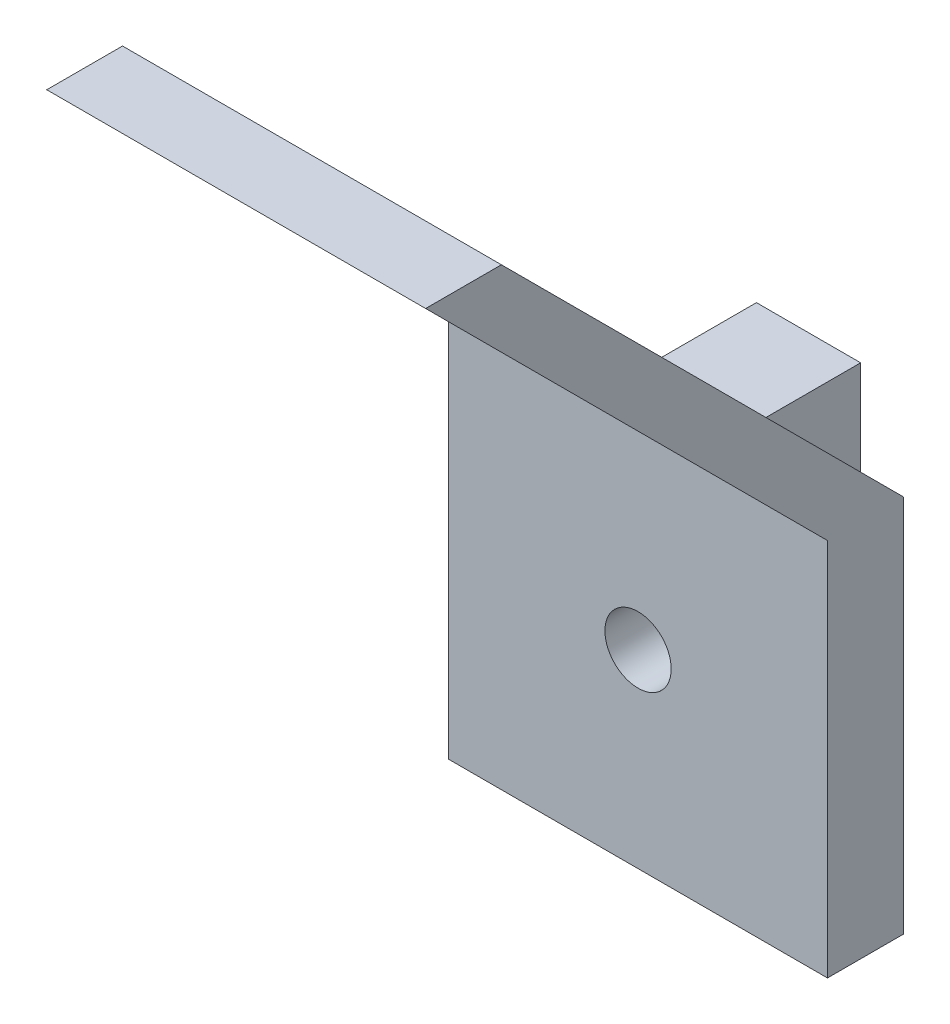
ISO-10303-21;
HEADER;
FILE_DESCRIPTION(('STEP AP214'),'2;1');
FILE_NAME('part.step','',(''),(''),'','','');
FILE_SCHEMA(('AUTOMOTIVE_DESIGN { 1 0 10303 214 1 1 1 1 }'));
ENDSEC;
DATA;
#1=APPLICATION_CONTEXT('core data for automotive mechanical design processes');
#2=APPLICATION_PROTOCOL_DEFINITION('international standard','automotive_design',2000,#1);
#3=PRODUCT_CONTEXT('',#1,'mechanical');
#4=PRODUCT('Part','Part','',(#3));
#5=PRODUCT_RELATED_PRODUCT_CATEGORY('part','',(#4));
#6=PRODUCT_DEFINITION_FORMATION('','',#4);
#7=PRODUCT_DEFINITION_CONTEXT('part definition',#1,'design');
#8=PRODUCT_DEFINITION('design','',#6,#7);
#9=PRODUCT_DEFINITION_SHAPE('','',#8);
#10=(LENGTH_UNIT() NAMED_UNIT(*) SI_UNIT(.MILLI.,.METRE.));
#11=(NAMED_UNIT(*) PLANE_ANGLE_UNIT() SI_UNIT($,.RADIAN.));
#12=(NAMED_UNIT(*) SI_UNIT($,.STERADIAN.) SOLID_ANGLE_UNIT());
#13=UNCERTAINTY_MEASURE_WITH_UNIT(LENGTH_MEASURE(1.E-05),#10,'distance_accuracy_value','');
#14=(GEOMETRIC_REPRESENTATION_CONTEXT(3) GLOBAL_UNCERTAINTY_ASSIGNED_CONTEXT((#13)) GLOBAL_UNIT_ASSIGNED_CONTEXT((#10,
#11,#12)) REPRESENTATION_CONTEXT('',''));
#15=CARTESIAN_POINT('',(0.,0.,0.));
#16=DIRECTION('',(0.,0.,1.));
#17=DIRECTION('',(1.,0.,0.));
#18=AXIS2_PLACEMENT_3D('',#15,#16,#17);
#19=CARTESIAN_POINT('',(20.,0.,0.));
#20=DIRECTION('',(0.,0.,1.));
#21=DIRECTION('',(1.,0.,0.));
#22=AXIS2_PLACEMENT_3D('',#19,#20,#21);
#23=PLANE('',#22);
#24=CARTESIAN_POINT('',(10.,9.99999999999999,0.));
#25=DIRECTION('',(0.,0.,1.));
#26=DIRECTION('',(1.,0.,0.));
#27=AXIS2_PLACEMENT_3D('',#24,#25,#26);
#28=CIRCLE('',#27,1.75);
#29=CARTESIAN_POINT('',(11.75,9.99999999999999,0.));
#30=VERTEX_POINT('',#29);
#31=EDGE_CURVE('E224',#30,#30,#28,.T.);
#32=ORIENTED_EDGE('',*,*,#31,.T.);
#33=EDGE_LOOP('',(#32));
#34=FACE_BOUND('',#33,.T.);
#35=DIRECTION('',(0.,-1.,0.));
#36=VECTOR('',#35,1.);
#37=CARTESIAN_POINT('',(12.75,0.,0.));
#38=LINE('',#37,#36);
#39=CARTESIAN_POINT('',(12.75,5.,0.));
#40=VERTEX_POINT('',#39);
#41=CARTESIAN_POINT('',(12.75,0.,0.));
#42=VERTEX_POINT('',#41);
#43=EDGE_CURVE('E54',#40,#42,#38,.T.);
#44=ORIENTED_EDGE('',*,*,#43,.F.);
#45=DIRECTION('',(1.,0.,0.));
#46=VECTOR('',#45,1.);
#47=CARTESIAN_POINT('',(7.25,5.,0.));
#48=LINE('',#47,#46);
#49=CARTESIAN_POINT('',(7.25,5.,0.));
#50=VERTEX_POINT('',#49);
#51=EDGE_CURVE('E58',#50,#40,#48,.T.);
#52=ORIENTED_EDGE('',*,*,#51,.F.);
#53=DIRECTION('',(0.,1.,0.));
#54=VECTOR('',#53,1.);
#55=CARTESIAN_POINT('',(7.25,0.,0.));
#56=LINE('',#55,#54);
#57=CARTESIAN_POINT('',(7.25,0.,0.));
#58=VERTEX_POINT('',#57);
#59=EDGE_CURVE('E431',#58,#50,#56,.T.);
#60=ORIENTED_EDGE('',*,*,#59,.F.);
#61=DIRECTION('',(-1.,0.,0.));
#62=VECTOR('',#61,1.);
#63=CARTESIAN_POINT('',(20.,0.,0.));
#64=LINE('',#63,#62);
#65=CARTESIAN_POINT('',(0.,0.,0.));
#66=VERTEX_POINT('',#65);
#67=EDGE_CURVE('E48',#58,#66,#64,.T.);
#68=ORIENTED_EDGE('',*,*,#67,.T.);
#69=DIRECTION('',(0.,1.,0.));
#70=VECTOR('',#69,1.);
#71=CARTESIAN_POINT('',(0.,0.,0.));
#72=LINE('',#71,#70);
#73=CARTESIAN_POINT('',(0.,20.,0.));
#74=VERTEX_POINT('',#73);
#75=EDGE_CURVE('E255',#66,#74,#72,.T.);
#76=ORIENTED_EDGE('',*,*,#75,.T.);
#77=DIRECTION('',(-1.,0.,0.));
#78=VECTOR('',#77,1.);
#79=CARTESIAN_POINT('',(20.,20.,0.));
#80=LINE('',#79,#78);
#81=CARTESIAN_POINT('',(7.25,20.,0.));
#82=VERTEX_POINT('',#81);
#83=EDGE_CURVE('E284',#82,#74,#80,.T.);
#84=ORIENTED_EDGE('',*,*,#83,.F.);
#85=DIRECTION('',(0.,1.,0.));
#86=VECTOR('',#85,1.);
#87=CARTESIAN_POINT('',(7.25,15.,0.));
#88=LINE('',#87,#86);
#89=CARTESIAN_POINT('',(7.25,15.,0.));
#90=VERTEX_POINT('',#89);
#91=EDGE_CURVE('E193',#90,#82,#88,.T.);
#92=ORIENTED_EDGE('',*,*,#91,.F.);
#93=DIRECTION('',(-1.,0.,0.));
#94=VECTOR('',#93,1.);
#95=CARTESIAN_POINT('',(7.25,15.,0.));
#96=LINE('',#95,#94);
#97=CARTESIAN_POINT('',(12.75,15.,0.));
#98=VERTEX_POINT('',#97);
#99=EDGE_CURVE('E169',#98,#90,#96,.T.);
#100=ORIENTED_EDGE('',*,*,#99,.F.);
#101=DIRECTION('',(0.,-1.,0.));
#102=VECTOR('',#101,1.);
#103=CARTESIAN_POINT('',(12.75,15.,0.));
#104=LINE('',#103,#102);
#105=CARTESIAN_POINT('',(12.75,20.,0.));
#106=VERTEX_POINT('',#105);
#107=EDGE_CURVE('E164',#106,#98,#104,.T.);
#108=ORIENTED_EDGE('',*,*,#107,.F.);
#109=CARTESIAN_POINT('',(20.,20.,0.));
#110=VERTEX_POINT('',#109);
#111=EDGE_CURVE('E285',#110,#106,#80,.T.);
#112=ORIENTED_EDGE('',*,*,#111,.F.);
#113=DIRECTION('',(0.,1.,0.));
#114=VECTOR('',#113,1.);
#115=CARTESIAN_POINT('',(20.,0.,0.));
#116=LINE('',#115,#114);
#117=CARTESIAN_POINT('',(20.,0.,0.));
#118=VERTEX_POINT('',#117);
#119=EDGE_CURVE('E236',#118,#110,#116,.T.);
#120=ORIENTED_EDGE('',*,*,#119,.F.);
#121=EDGE_CURVE('E11',#118,#42,#64,.T.);
#122=ORIENTED_EDGE('',*,*,#121,.T.);
#123=EDGE_LOOP('',(#44,#52,#60,#68,#76,#84,#92,#100,#108,#112,#120,#122));
#124=FACE_BOUND('',#123,.T.);
#125=ADVANCED_FACE('F39',(#34,#124),#23,.F.);
#126=CARTESIAN_POINT('',(20.,0.,4.));
#127=DIRECTION('',(0.,1.,0.));
#128=DIRECTION('',(0.,0.,1.));
#129=AXIS2_PLACEMENT_3D('',#126,#127,#128);
#130=PLANE('',#129);
#131=DIRECTION('',(0.,0.,-1.));
#132=VECTOR('',#131,1.);
#133=CARTESIAN_POINT('',(0.,0.,4.));
#134=LINE('',#133,#132);
#135=CARTESIAN_POINT('',(0.,0.,4.));
#136=VERTEX_POINT('',#135);
#137=EDGE_CURVE('E228',#136,#66,#134,.T.);
#138=ORIENTED_EDGE('',*,*,#137,.T.);
#139=ORIENTED_EDGE('',*,*,#67,.F.);
#140=DIRECTION('',(0.,0.,1.));
#141=VECTOR('',#140,1.);
#142=CARTESIAN_POINT('',(7.25,0.,-5.));
#143=LINE('',#142,#141);
#144=CARTESIAN_POINT('',(7.25,0.,-5.));
#145=VERTEX_POINT('',#144);
#146=EDGE_CURVE('E146',#145,#58,#143,.T.);
#147=ORIENTED_EDGE('',*,*,#146,.F.);
#148=DIRECTION('',(-1.,0.,0.));
#149=VECTOR('',#148,1.);
#150=CARTESIAN_POINT('',(7.25,0.,-5.));
#151=LINE('',#150,#149);
#152=CARTESIAN_POINT('',(12.75,0.,-5.));
#153=VERTEX_POINT('',#152);
#154=EDGE_CURVE('E139',#153,#145,#151,.T.);
#155=ORIENTED_EDGE('',*,*,#154,.F.);
#156=DIRECTION('',(0.,0.,1.));
#157=VECTOR('',#156,1.);
#158=CARTESIAN_POINT('',(12.75,0.,-5.));
#159=LINE('',#158,#157);
#160=EDGE_CURVE('E144',#153,#42,#159,.T.);
#161=ORIENTED_EDGE('',*,*,#160,.T.);
#162=ORIENTED_EDGE('',*,*,#121,.F.);
#163=DIRECTION('',(0.,0.,-1.));
#164=VECTOR('',#163,1.);
#165=CARTESIAN_POINT('',(20.,0.,4.));
#166=LINE('',#165,#164);
#167=CARTESIAN_POINT('',(20.,0.,4.));
#168=VERTEX_POINT('',#167);
#169=EDGE_CURVE('E232',#168,#118,#166,.T.);
#170=ORIENTED_EDGE('',*,*,#169,.F.);
#171=DIRECTION('',(-1.,0.,0.));
#172=VECTOR('',#171,1.);
#173=CARTESIAN_POINT('',(20.,0.,4.));
#174=LINE('',#173,#172);
#175=EDGE_CURVE('E252',#168,#136,#174,.T.);
#176=ORIENTED_EDGE('',*,*,#175,.T.);
#177=EDGE_LOOP('',(#138,#139,#147,#155,#161,#162,#170,#176));
#178=FACE_BOUND('',#177,.T.);
#179=ADVANCED_FACE('F41',(#178),#130,.F.);
#180=CARTESIAN_POINT('',(20.,20.,0.));
#181=DIRECTION('',(0.,-0.707106781186549,0.707106781186546));
#182=DIRECTION('',(0.,-0.707106781186546,-0.707106781186549));
#183=AXIS2_PLACEMENT_3D('',#180,#181,#182);
#184=PLANE('',#183);
#185=CARTESIAN_POINT('',(10.,32.6066017177982,12.6066017177982));
#186=DIRECTION('',(0.,-0.707106781186549,0.707106781186546));
#187=DIRECTION('',(0.,-0.707106781186546,-0.707106781186549));
#188=AXIS2_PLACEMENT_3D('',#185,#186,#187);
#189=CIRCLE('',#188,3.3782);
#190=CARTESIAN_POINT('',(10.,30.2178535895938,10.2178535895938));
#191=VERTEX_POINT('',#190);
#192=EDGE_CURVE('E219',#191,#191,#189,.T.);
#193=ORIENTED_EDGE('',*,*,#192,.T.);
#194=EDGE_LOOP('',(#193));
#195=FACE_BOUND('',#194,.T.);
#196=DIRECTION('',(0.,0.707106781186546,0.707106781186549));
#197=VECTOR('',#196,1.);
#198=CARTESIAN_POINT('',(0.,20.,0.));
#199=LINE('',#198,#197);
#200=CARTESIAN_POINT('',(0.,41.2132034355964,21.2132034355965));
#201=VERTEX_POINT('',#200);
#202=EDGE_CURVE('E259',#74,#201,#199,.T.);
#203=ORIENTED_EDGE('',*,*,#202,.T.);
#204=DIRECTION('',(-1.,0.,0.));
#205=VECTOR('',#204,1.);
#206=CARTESIAN_POINT('',(20.,41.2132034355964,21.2132034355965));
#207=LINE('',#206,#205);
#208=CARTESIAN_POINT('',(20.,41.2132034355964,21.2132034355965));
#209=VERTEX_POINT('',#208);
#210=EDGE_CURVE('E281',#209,#201,#207,.T.);
#211=ORIENTED_EDGE('',*,*,#210,.F.);
#212=DIRECTION('',(0.,0.707106781186546,0.707106781186549));
#213=VECTOR('',#212,1.);
#214=CARTESIAN_POINT('',(20.,20.,0.));
#215=LINE('',#214,#213);
#216=EDGE_CURVE('E240',#110,#209,#215,.T.);
#217=ORIENTED_EDGE('',*,*,#216,.F.);
#218=ORIENTED_EDGE('',*,*,#111,.T.);
#219=DIRECTION('',(1.,0.,0.));
#220=VECTOR('',#219,1.);
#221=CARTESIAN_POINT('',(7.25,20.,0.));
#222=LINE('',#221,#220);
#223=EDGE_CURVE('E180',#82,#106,#222,.T.);
#224=ORIENTED_EDGE('',*,*,#223,.F.);
#225=ORIENTED_EDGE('',*,*,#83,.T.);
#226=EDGE_LOOP('',(#203,#211,#217,#218,#224,#225));
#227=FACE_BOUND('',#226,.T.);
#228=ADVANCED_FACE('F294',(#195,#227),#184,.F.);
#229=CARTESIAN_POINT('',(20.,41.2132034355964,21.2132034355965));
#230=DIRECTION('',(0.,-1.,0.));
#231=DIRECTION('',(0.,0.,-1.));
#232=AXIS2_PLACEMENT_3D('',#229,#230,#231);
#233=PLANE('',#232);
#234=DIRECTION('',(0.,0.,1.));
#235=VECTOR('',#234,1.);
#236=CARTESIAN_POINT('',(0.,41.2132034355964,21.2132034355965));
#237=LINE('',#236,#235);
#238=CARTESIAN_POINT('',(0.,41.2132034355964,25.2132034355965));
#239=VERTEX_POINT('',#238);
#240=EDGE_CURVE('E262',#201,#239,#237,.T.);
#241=ORIENTED_EDGE('',*,*,#240,.T.);
#242=DIRECTION('',(-1.,0.,0.));
#243=VECTOR('',#242,1.);
#244=CARTESIAN_POINT('',(20.,41.2132034355964,25.2132034355965));
#245=LINE('',#244,#243);
#246=CARTESIAN_POINT('',(20.,41.2132034355964,25.2132034355965));
#247=VERTEX_POINT('',#246);
#248=EDGE_CURVE('E277',#247,#239,#245,.T.);
#249=ORIENTED_EDGE('',*,*,#248,.F.);
#250=DIRECTION('',(0.,0.,1.));
#251=VECTOR('',#250,1.);
#252=CARTESIAN_POINT('',(20.,41.2132034355964,21.2132034355965));
#253=LINE('',#252,#251);
#254=EDGE_CURVE('E243',#209,#247,#253,.T.);
#255=ORIENTED_EDGE('',*,*,#254,.F.);
#256=ORIENTED_EDGE('',*,*,#210,.T.);
#257=EDGE_LOOP('',(#241,#249,#255,#256));
#258=FACE_BOUND('',#257,.T.);
#259=ADVANCED_FACE('F306',(#258),#233,.F.);
#260=CARTESIAN_POINT('',(20.,41.2132034355964,25.2132034355965));
#261=DIRECTION('',(0.,0.707106781186549,-0.707106781186546));
#262=DIRECTION('',(0.,0.707106781186546,0.707106781186549));
#263=AXIS2_PLACEMENT_3D('',#260,#261,#262);
#264=PLANE('',#263);
#265=CARTESIAN_POINT('',(10.,30.6066017177982,14.6066017177982));
#266=DIRECTION('',(0.,-0.707106781186549,0.707106781186546));
#267=DIRECTION('',(0.,-0.707106781186546,-0.707106781186549));
#268=AXIS2_PLACEMENT_3D('',#265,#266,#267);
#269=CIRCLE('',#268,3.3782);
#270=CARTESIAN_POINT('',(10.,28.2178535895938,12.2178535895938));
#271=VERTEX_POINT('',#270);
#272=EDGE_CURVE('E215',#271,#271,#269,.T.);
#273=ORIENTED_EDGE('',*,*,#272,.F.);
#274=EDGE_LOOP('',(#273));
#275=FACE_BOUND('',#274,.T.);
#276=DIRECTION('',(0.,-0.707106781186546,-0.707106781186549));
#277=VECTOR('',#276,1.);
#278=CARTESIAN_POINT('',(0.,41.2132034355964,25.2132034355965));
#279=LINE('',#278,#277);
#280=CARTESIAN_POINT('',(0.,20.,4.));
#281=VERTEX_POINT('',#280);
#282=EDGE_CURVE('E265',#239,#281,#279,.T.);
#283=ORIENTED_EDGE('',*,*,#282,.T.);
#284=DIRECTION('',(-1.,0.,0.));
#285=VECTOR('',#284,1.);
#286=CARTESIAN_POINT('',(20.,20.,4.));
#287=LINE('',#286,#285);
#288=CARTESIAN_POINT('',(20.,20.,4.));
#289=VERTEX_POINT('',#288);
#290=EDGE_CURVE('E273',#289,#281,#287,.T.);
#291=ORIENTED_EDGE('',*,*,#290,.F.);
#292=DIRECTION('',(0.,-0.707106781186546,-0.707106781186549));
#293=VECTOR('',#292,1.);
#294=CARTESIAN_POINT('',(20.,41.2132034355964,25.2132034355965));
#295=LINE('',#294,#293);
#296=EDGE_CURVE('E246',#247,#289,#295,.T.);
#297=ORIENTED_EDGE('',*,*,#296,.F.);
#298=ORIENTED_EDGE('',*,*,#248,.T.);
#299=EDGE_LOOP('',(#283,#291,#297,#298));
#300=FACE_BOUND('',#299,.T.);
#301=ADVANCED_FACE('F310',(#275,#300),#264,.F.);
#302=CARTESIAN_POINT('',(20.,20.,4.));
#303=DIRECTION('',(0.,0.,-1.));
#304=DIRECTION('',(0.,1.,0.));
#305=AXIS2_PLACEMENT_3D('',#302,#303,#304);
#306=PLANE('',#305);
#307=CARTESIAN_POINT('',(10.,9.99999999999999,4.));
#308=DIRECTION('',(0.,0.,1.));
#309=DIRECTION('',(1.,0.,0.));
#310=AXIS2_PLACEMENT_3D('',#307,#308,#309);
#311=CIRCLE('',#310,1.75);
#312=CARTESIAN_POINT('',(11.75,9.99999999999999,4.));
#313=VERTEX_POINT('',#312);
#314=EDGE_CURVE('E223',#313,#313,#311,.T.);
#315=ORIENTED_EDGE('',*,*,#314,.F.);
#316=EDGE_LOOP('',(#315));
#317=FACE_BOUND('',#316,.T.);
#318=DIRECTION('',(0.,-1.,0.));
#319=VECTOR('',#318,1.);
#320=CARTESIAN_POINT('',(0.,20.,4.));
#321=LINE('',#320,#319);
#322=EDGE_CURVE('E237',#281,#136,#321,.T.);
#323=ORIENTED_EDGE('',*,*,#322,.T.);
#324=ORIENTED_EDGE('',*,*,#175,.F.);
#325=DIRECTION('',(0.,-1.,0.));
#326=VECTOR('',#325,1.);
#327=CARTESIAN_POINT('',(20.,20.,4.));
#328=LINE('',#327,#326);
#329=EDGE_CURVE('E249',#289,#168,#328,.T.);
#330=ORIENTED_EDGE('',*,*,#329,.F.);
#331=ORIENTED_EDGE('',*,*,#290,.T.);
#332=EDGE_LOOP('',(#323,#324,#330,#331));
#333=FACE_BOUND('',#332,.T.);
#334=ADVANCED_FACE('F356',(#317,#333),#306,.F.);
#335=CARTESIAN_POINT('',(20.,0.,0.));
#336=DIRECTION('',(1.,0.,0.));
#337=DIRECTION('',(0.,0.,-1.));
#338=AXIS2_PLACEMENT_3D('',#335,#336,#337);
#339=PLANE('',#338);
#340=ORIENTED_EDGE('',*,*,#169,.T.);
#341=ORIENTED_EDGE('',*,*,#119,.T.);
#342=ORIENTED_EDGE('',*,*,#216,.T.);
#343=ORIENTED_EDGE('',*,*,#254,.T.);
#344=ORIENTED_EDGE('',*,*,#296,.T.);
#345=ORIENTED_EDGE('',*,*,#329,.T.);
#346=EDGE_LOOP('',(#340,#341,#342,#343,#344,#345));
#347=FACE_BOUND('',#346,.T.);
#348=ADVANCED_FACE('F314',(#347),#339,.T.);
#349=CARTESIAN_POINT('',(0.,0.,0.));
#350=DIRECTION('',(1.,0.,0.));
#351=DIRECTION('',(0.,0.,-1.));
#352=AXIS2_PLACEMENT_3D('',#349,#350,#351);
#353=PLANE('',#352);
#354=ORIENTED_EDGE('',*,*,#137,.F.);
#355=ORIENTED_EDGE('',*,*,#322,.F.);
#356=ORIENTED_EDGE('',*,*,#282,.F.);
#357=ORIENTED_EDGE('',*,*,#240,.F.);
#358=ORIENTED_EDGE('',*,*,#202,.F.);
#359=ORIENTED_EDGE('',*,*,#75,.F.);
#360=EDGE_LOOP('',(#354,#355,#356,#357,#358,#359));
#361=FACE_BOUND('',#360,.T.);
#362=ADVANCED_FACE('F301',(#361),#353,.F.);
#363=CARTESIAN_POINT('',(10.,9.99999999999999,0.));
#364=DIRECTION('',(0.,0.,1.));
#365=DIRECTION('',(1.,0.,0.));
#366=AXIS2_PLACEMENT_3D('',#363,#364,#365);
#367=CYLINDRICAL_SURFACE('',#366,1.75);
#368=ORIENTED_EDGE('',*,*,#31,.F.);
#369=EDGE_LOOP('',(#368));
#370=FACE_BOUND('',#369,.T.);
#371=ORIENTED_EDGE('',*,*,#314,.T.);
#372=EDGE_LOOP('',(#371));
#373=FACE_BOUND('',#372,.T.);
#374=ADVANCED_FACE('F363',(#370,#373),#367,.F.);
#375=CARTESIAN_POINT('',(10.,43.2132034355964,2.00000000000005));
#376=DIRECTION('',(0.,-0.707106781186549,0.707106781186546));
#377=DIRECTION('',(0.,-0.707106781186546,-0.707106781186549));
#378=AXIS2_PLACEMENT_3D('',#375,#376,#377);
#379=CYLINDRICAL_SURFACE('',#378,3.3782);
#380=ORIENTED_EDGE('',*,*,#272,.T.);
#381=EDGE_LOOP('',(#380));
#382=FACE_BOUND('',#381,.T.);
#383=ORIENTED_EDGE('',*,*,#192,.F.);
#384=EDGE_LOOP('',(#383));
#385=FACE_BOUND('',#384,.T.);
#386=ADVANCED_FACE('F368',(#382,#385),#379,.F.);
#387=CARTESIAN_POINT('',(12.75,15.,-5.));
#388=DIRECTION('',(-1.,0.,0.));
#389=DIRECTION('',(0.,0.,1.));
#390=AXIS2_PLACEMENT_3D('',#387,#388,#389);
#391=PLANE('',#390);
#392=ORIENTED_EDGE('',*,*,#107,.T.);
#393=DIRECTION('',(0.,0.,1.));
#394=VECTOR('',#393,1.);
#395=CARTESIAN_POINT('',(12.75,15.,-5.));
#396=LINE('',#395,#394);
#397=CARTESIAN_POINT('',(12.75,15.,-5.));
#398=VERTEX_POINT('',#397);
#399=EDGE_CURVE('E211',#398,#98,#396,.T.);
#400=ORIENTED_EDGE('',*,*,#399,.F.);
#401=DIRECTION('',(0.,-1.,0.));
#402=VECTOR('',#401,1.);
#403=CARTESIAN_POINT('',(12.75,15.,-5.));
#404=LINE('',#403,#402);
#405=CARTESIAN_POINT('',(12.75,20.,-5.));
#406=VERTEX_POINT('',#405);
#407=EDGE_CURVE('E175',#406,#398,#404,.T.);
#408=ORIENTED_EDGE('',*,*,#407,.F.);
#409=DIRECTION('',(0.,0.,1.));
#410=VECTOR('',#409,1.);
#411=CARTESIAN_POINT('',(12.75,20.,-5.));
#412=LINE('',#411,#410);
#413=EDGE_CURVE('E188',#406,#106,#412,.T.);
#414=ORIENTED_EDGE('',*,*,#413,.T.);
#415=EDGE_LOOP('',(#392,#400,#408,#414));
#416=FACE_BOUND('',#415,.T.);
#417=ADVANCED_FACE('F319',(#416),#391,.F.);
#418=CARTESIAN_POINT('',(7.25,15.,-5.));
#419=DIRECTION('',(0.,1.,0.));
#420=DIRECTION('',(-1.,0.,0.));
#421=AXIS2_PLACEMENT_3D('',#418,#419,#420);
#422=PLANE('',#421);
#423=ORIENTED_EDGE('',*,*,#99,.T.);
#424=DIRECTION('',(0.,0.,1.));
#425=VECTOR('',#424,1.);
#426=CARTESIAN_POINT('',(7.25,15.,-5.));
#427=LINE('',#426,#425);
#428=CARTESIAN_POINT('',(7.25,15.,-5.));
#429=VERTEX_POINT('',#428);
#430=EDGE_CURVE('E207',#429,#90,#427,.T.);
#431=ORIENTED_EDGE('',*,*,#430,.F.);
#432=DIRECTION('',(-1.,0.,0.));
#433=VECTOR('',#432,1.);
#434=CARTESIAN_POINT('',(7.25,15.,-5.));
#435=LINE('',#434,#433);
#436=EDGE_CURVE('E179',#398,#429,#435,.T.);
#437=ORIENTED_EDGE('',*,*,#436,.F.);
#438=ORIENTED_EDGE('',*,*,#399,.T.);
#439=EDGE_LOOP('',(#423,#431,#437,#438));
#440=FACE_BOUND('',#439,.T.);
#441=ADVANCED_FACE('F331',(#440),#422,.F.);
#442=CARTESIAN_POINT('',(7.25,15.,-5.));
#443=DIRECTION('',(1.,0.,0.));
#444=DIRECTION('',(0.,1.,0.));
#445=AXIS2_PLACEMENT_3D('',#442,#443,#444);
#446=PLANE('',#445);
#447=ORIENTED_EDGE('',*,*,#91,.T.);
#448=DIRECTION('',(0.,0.,1.));
#449=VECTOR('',#448,1.);
#450=CARTESIAN_POINT('',(7.25,20.,-5.));
#451=LINE('',#450,#449);
#452=CARTESIAN_POINT('',(7.25,20.,-5.));
#453=VERTEX_POINT('',#452);
#454=EDGE_CURVE('E203',#453,#82,#451,.T.);
#455=ORIENTED_EDGE('',*,*,#454,.F.);
#456=DIRECTION('',(0.,1.,0.));
#457=VECTOR('',#456,1.);
#458=CARTESIAN_POINT('',(7.25,15.,-5.));
#459=LINE('',#458,#457);
#460=EDGE_CURVE('E183',#429,#453,#459,.T.);
#461=ORIENTED_EDGE('',*,*,#460,.F.);
#462=ORIENTED_EDGE('',*,*,#430,.T.);
#463=EDGE_LOOP('',(#447,#455,#461,#462));
#464=FACE_BOUND('',#463,.T.);
#465=ADVANCED_FACE('F328',(#464),#446,.F.);
#466=CARTESIAN_POINT('',(7.25,20.,-5.));
#467=DIRECTION('',(0.,-1.,0.));
#468=DIRECTION('',(0.,0.,-1.));
#469=AXIS2_PLACEMENT_3D('',#466,#467,#468);
#470=PLANE('',#469);
#471=ORIENTED_EDGE('',*,*,#223,.T.);
#472=ORIENTED_EDGE('',*,*,#413,.F.);
#473=DIRECTION('',(1.,0.,0.));
#474=VECTOR('',#473,1.);
#475=CARTESIAN_POINT('',(7.25,20.,-5.));
#476=LINE('',#475,#474);
#477=EDGE_CURVE('E186',#453,#406,#476,.T.);
#478=ORIENTED_EDGE('',*,*,#477,.F.);
#479=ORIENTED_EDGE('',*,*,#454,.T.);
#480=EDGE_LOOP('',(#471,#472,#478,#479));
#481=FACE_BOUND('',#480,.T.);
#482=ADVANCED_FACE('F324',(#481),#470,.F.);
#483=CARTESIAN_POINT('',(0.,0.,-5.));
#484=DIRECTION('',(0.,0.,-1.));
#485=DIRECTION('',(-1.,0.,0.));
#486=AXIS2_PLACEMENT_3D('',#483,#484,#485);
#487=PLANE('',#486);
#488=ORIENTED_EDGE('',*,*,#407,.T.);
#489=ORIENTED_EDGE('',*,*,#436,.T.);
#490=ORIENTED_EDGE('',*,*,#460,.T.);
#491=ORIENTED_EDGE('',*,*,#477,.T.);
#492=EDGE_LOOP('',(#488,#489,#490,#491));
#493=FACE_BOUND('',#492,.T.);
#494=ADVANCED_FACE('F333',(#493),#487,.T.);
#495=CARTESIAN_POINT('',(12.75,0.,-5.));
#496=DIRECTION('',(-1.,0.,0.));
#497=DIRECTION('',(0.,0.,1.));
#498=AXIS2_PLACEMENT_3D('',#495,#496,#497);
#499=PLANE('',#498);
#500=ORIENTED_EDGE('',*,*,#43,.T.);
#501=ORIENTED_EDGE('',*,*,#160,.F.);
#502=DIRECTION('',(0.,-1.,0.));
#503=VECTOR('',#502,1.);
#504=CARTESIAN_POINT('',(12.75,0.,-5.));
#505=LINE('',#504,#503);
#506=CARTESIAN_POINT('',(12.75,5.,-5.));
#507=VERTEX_POINT('',#506);
#508=EDGE_CURVE('E151',#507,#153,#505,.T.);
#509=ORIENTED_EDGE('',*,*,#508,.F.);
#510=DIRECTION('',(0.,0.,1.));
#511=VECTOR('',#510,1.);
#512=CARTESIAN_POINT('',(12.75,5.,-5.));
#513=LINE('',#512,#511);
#514=EDGE_CURVE('E428',#507,#40,#513,.T.);
#515=ORIENTED_EDGE('',*,*,#514,.T.);
#516=EDGE_LOOP('',(#500,#501,#509,#515));
#517=FACE_BOUND('',#516,.T.);
#518=ADVANCED_FACE('F162',(#517),#499,.F.);
#519=CARTESIAN_POINT('',(7.25,0.,-5.));
#520=DIRECTION('',(1.,0.,0.));
#521=DIRECTION('',(0.,1.,0.));
#522=AXIS2_PLACEMENT_3D('',#519,#520,#521);
#523=PLANE('',#522);
#524=ORIENTED_EDGE('',*,*,#59,.T.);
#525=DIRECTION('',(0.,0.,1.));
#526=VECTOR('',#525,1.);
#527=CARTESIAN_POINT('',(7.25,5.,-5.));
#528=LINE('',#527,#526);
#529=CARTESIAN_POINT('',(7.25,5.,-5.));
#530=VERTEX_POINT('',#529);
#531=EDGE_CURVE('E171',#530,#50,#528,.T.);
#532=ORIENTED_EDGE('',*,*,#531,.F.);
#533=DIRECTION('',(0.,1.,0.));
#534=VECTOR('',#533,1.);
#535=CARTESIAN_POINT('',(7.25,0.,-5.));
#536=LINE('',#535,#534);
#537=EDGE_CURVE('E150',#145,#530,#536,.T.);
#538=ORIENTED_EDGE('',*,*,#537,.F.);
#539=ORIENTED_EDGE('',*,*,#146,.T.);
#540=EDGE_LOOP('',(#524,#532,#538,#539));
#541=FACE_BOUND('',#540,.T.);
#542=ADVANCED_FACE('F340',(#541),#523,.F.);
#543=CARTESIAN_POINT('',(7.25,5.,-5.));
#544=DIRECTION('',(0.,-1.,0.));
#545=DIRECTION('',(1.,0.,0.));
#546=AXIS2_PLACEMENT_3D('',#543,#544,#545);
#547=PLANE('',#546);
#548=ORIENTED_EDGE('',*,*,#51,.T.);
#549=ORIENTED_EDGE('',*,*,#514,.F.);
#550=DIRECTION('',(1.,0.,0.));
#551=VECTOR('',#550,1.);
#552=CARTESIAN_POINT('',(7.25,5.,-5.));
#553=LINE('',#552,#551);
#554=EDGE_CURVE('E156',#530,#507,#553,.T.);
#555=ORIENTED_EDGE('',*,*,#554,.F.);
#556=ORIENTED_EDGE('',*,*,#531,.T.);
#557=EDGE_LOOP('',(#548,#549,#555,#556));
#558=FACE_BOUND('',#557,.T.);
#559=ADVANCED_FACE('F405',(#558),#547,.F.);
#560=CARTESIAN_POINT('',(0.,0.,-5.));
#561=DIRECTION('',(0.,0.,-1.));
#562=DIRECTION('',(-1.,0.,0.));
#563=AXIS2_PLACEMENT_3D('',#560,#561,#562);
#564=PLANE('',#563);
#565=ORIENTED_EDGE('',*,*,#508,.T.);
#566=ORIENTED_EDGE('',*,*,#154,.T.);
#567=ORIENTED_EDGE('',*,*,#537,.T.);
#568=ORIENTED_EDGE('',*,*,#554,.T.);
#569=EDGE_LOOP('',(#565,#566,#567,#568));
#570=FACE_BOUND('',#569,.T.);
#571=ADVANCED_FACE('F154',(#570),#564,.T.);
#572=CLOSED_SHELL('',(#125,#179,#228,#259,#301,#334,#348,#362,#374,#386,#417,#441,#465,#482,
#494,#518,#542,#559,#571));
#573=MANIFOLD_SOLID_BREP('B2',#572);
#574=ADVANCED_BREP_SHAPE_REPRESENTATION('',(#18,#573),#14);
#575=SHAPE_DEFINITION_REPRESENTATION(#9,#574);
ENDSEC;
END-ISO-10303-21;
